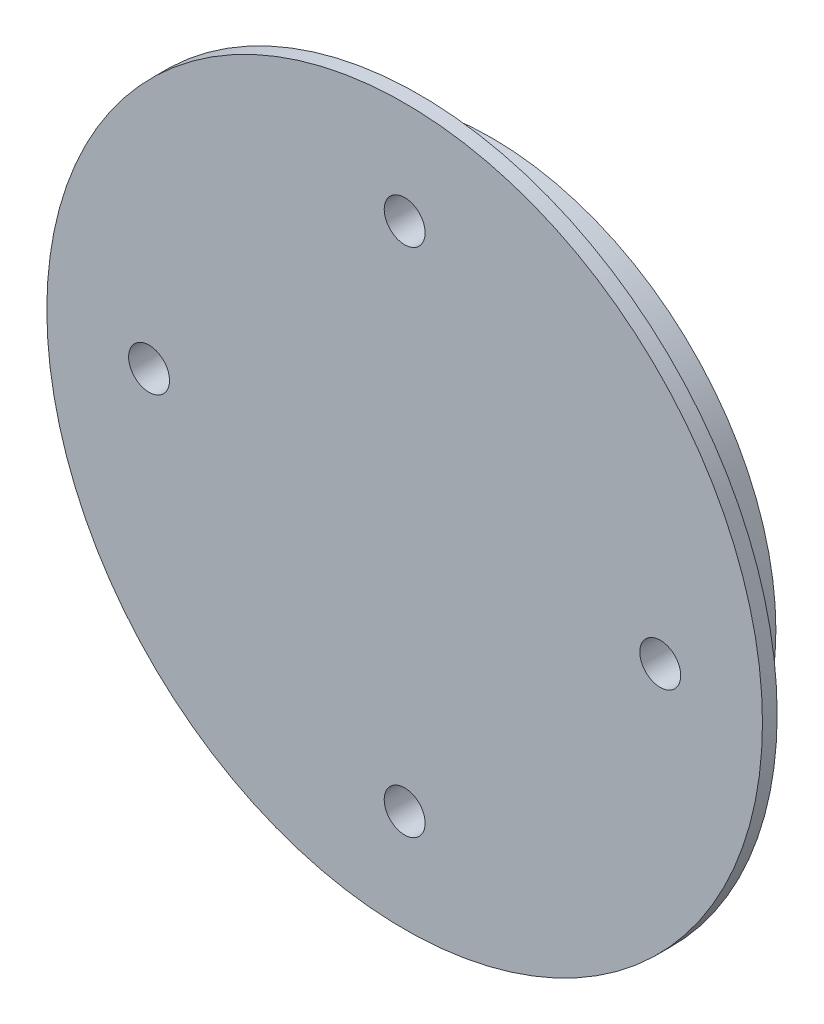
ISO-10303-21;
HEADER;
FILE_DESCRIPTION(('STEP AP214'),'2;1');
FILE_NAME('part.step','',(''),(''),'','','');
FILE_SCHEMA(('AUTOMOTIVE_DESIGN { 1 0 10303 214 1 1 1 1 }'));
ENDSEC;
DATA;
#1=APPLICATION_CONTEXT('core data for automotive mechanical design processes');
#2=APPLICATION_PROTOCOL_DEFINITION('international standard','automotive_design',2000,#1);
#3=PRODUCT_CONTEXT('',#1,'mechanical');
#4=PRODUCT('Part','Part','',(#3));
#5=PRODUCT_RELATED_PRODUCT_CATEGORY('part','',(#4));
#6=PRODUCT_DEFINITION_FORMATION('','',#4);
#7=PRODUCT_DEFINITION_CONTEXT('part definition',#1,'design');
#8=PRODUCT_DEFINITION('design','',#6,#7);
#9=PRODUCT_DEFINITION_SHAPE('','',#8);
#10=(LENGTH_UNIT() NAMED_UNIT(*) SI_UNIT(.MILLI.,.METRE.));
#11=(NAMED_UNIT(*) PLANE_ANGLE_UNIT() SI_UNIT($,.RADIAN.));
#12=(NAMED_UNIT(*) SI_UNIT($,.STERADIAN.) SOLID_ANGLE_UNIT());
#13=UNCERTAINTY_MEASURE_WITH_UNIT(LENGTH_MEASURE(1.E-05),#10,'distance_accuracy_value','');
#14=(GEOMETRIC_REPRESENTATION_CONTEXT(3) GLOBAL_UNCERTAINTY_ASSIGNED_CONTEXT((#13)) GLOBAL_UNIT_ASSIGNED_CONTEXT((#10,
#11,#12)) REPRESENTATION_CONTEXT('',''));
#15=CARTESIAN_POINT('',(0.,0.,0.));
#16=DIRECTION('',(0.,0.,1.));
#17=DIRECTION('',(1.,0.,0.));
#18=AXIS2_PLACEMENT_3D('',#15,#16,#17);
#19=CARTESIAN_POINT('',(0.,0.,2.5));
#20=DIRECTION('',(0.,0.,-1.));
#21=DIRECTION('',(-1.,0.,0.));
#22=AXIS2_PLACEMENT_3D('',#19,#20,#21);
#23=CYLINDRICAL_SURFACE('',#22,23.5);
#24=CARTESIAN_POINT('',(0.,0.,2.5));
#25=DIRECTION('',(0.,0.,1.));
#26=DIRECTION('',(1.,0.,0.));
#27=AXIS2_PLACEMENT_3D('',#24,#25,#26);
#28=CIRCLE('',#27,23.5);
#29=CARTESIAN_POINT('',(23.5,0.,2.5));
#30=VERTEX_POINT('',#29);
#31=EDGE_CURVE('E42',#30,#30,#28,.T.);
#32=ORIENTED_EDGE('',*,*,#31,.F.);
#33=EDGE_LOOP('',(#32));
#34=FACE_BOUND('',#33,.T.);
#35=CARTESIAN_POINT('',(0.,0.,0.));
#36=DIRECTION('',(0.,0.,1.));
#37=DIRECTION('',(1.,0.,0.));
#38=AXIS2_PLACEMENT_3D('',#35,#36,#37);
#39=CIRCLE('',#38,23.5);
#40=CARTESIAN_POINT('',(23.5,0.,0.));
#41=VERTEX_POINT('',#40);
#42=EDGE_CURVE('E38',#41,#41,#39,.T.);
#43=ORIENTED_EDGE('',*,*,#42,.T.);
#44=EDGE_LOOP('',(#43));
#45=FACE_BOUND('',#44,.T.);
#46=ADVANCED_FACE('F35',(#34,#45),#23,.T.);
#47=CARTESIAN_POINT('',(0.,0.,0.));
#48=DIRECTION('',(0.,0.,1.));
#49=DIRECTION('',(1.,0.,0.));
#50=AXIS2_PLACEMENT_3D('',#47,#48,#49);
#51=PLANE('',#50);
#52=CARTESIAN_POINT('',(0.,0.,0.));
#53=DIRECTION('',(0.,0.,-1.));
#54=DIRECTION('',(-1.,0.,0.));
#55=AXIS2_PLACEMENT_3D('',#52,#53,#54);
#56=CIRCLE('',#55,22.225);
#57=CARTESIAN_POINT('',(-22.225,0.,0.));
#58=VERTEX_POINT('',#57);
#59=EDGE_CURVE('E10',#58,#58,#56,.T.);
#60=ORIENTED_EDGE('',*,*,#59,.F.);
#61=EDGE_LOOP('',(#60));
#62=FACE_BOUND('',#61,.T.);
#63=ORIENTED_EDGE('',*,*,#42,.F.);
#64=EDGE_LOOP('',(#63));
#65=FACE_BOUND('',#64,.T.);
#66=ADVANCED_FACE('F103',(#62,#65),#51,.F.);
#67=CARTESIAN_POINT('',(0.,0.,-3.175));
#68=DIRECTION('',(0.,0.,1.));
#69=DIRECTION('',(1.,0.,0.));
#70=AXIS2_PLACEMENT_3D('',#67,#68,#69);
#71=CYLINDRICAL_SURFACE('',#70,22.225);
#72=CARTESIAN_POINT('',(0.,0.,-3.175));
#73=DIRECTION('',(0.,0.,-1.));
#74=DIRECTION('',(-1.,0.,0.));
#75=AXIS2_PLACEMENT_3D('',#72,#73,#74);
#76=CIRCLE('',#75,22.225);
#77=CARTESIAN_POINT('',(-22.225,0.,-3.175));
#78=VERTEX_POINT('',#77);
#79=EDGE_CURVE('E48',#78,#78,#76,.T.);
#80=ORIENTED_EDGE('',*,*,#79,.F.);
#81=EDGE_LOOP('',(#80));
#82=FACE_BOUND('',#81,.T.);
#83=ORIENTED_EDGE('',*,*,#59,.T.);
#84=EDGE_LOOP('',(#83));
#85=FACE_BOUND('',#84,.T.);
#86=ADVANCED_FACE('F108',(#82,#85),#71,.T.);
#87=CARTESIAN_POINT('',(0.,0.,-3.175));
#88=DIRECTION('',(0.,0.,-1.));
#89=DIRECTION('',(-1.,0.,0.));
#90=AXIS2_PLACEMENT_3D('',#87,#88,#89);
#91=PLANE('',#90);
#92=CARTESIAN_POINT('',(0.,20.,-3.175));
#93=DIRECTION('',(0.,0.,-1.));
#94=DIRECTION('',(-1.,0.,0.));
#95=AXIS2_PLACEMENT_3D('',#92,#93,#94);
#96=CIRCLE('',#95,1.6);
#97=CARTESIAN_POINT('',(-1.6,20.,-3.175));
#98=VERTEX_POINT('',#97);
#99=EDGE_CURVE('E51',#98,#98,#96,.T.);
#100=ORIENTED_EDGE('',*,*,#99,.F.);
#101=EDGE_LOOP('',(#100));
#102=FACE_BOUND('',#101,.T.);
#103=CARTESIAN_POINT('',(-20.,0.,-3.175));
#104=DIRECTION('',(0.,0.,-1.));
#105=DIRECTION('',(-1.,0.,0.));
#106=AXIS2_PLACEMENT_3D('',#103,#104,#105);
#107=CIRCLE('',#106,1.6);
#108=CARTESIAN_POINT('',(-21.6,0.,-3.175));
#109=VERTEX_POINT('',#108);
#110=EDGE_CURVE('E59',#109,#109,#107,.T.);
#111=ORIENTED_EDGE('',*,*,#110,.F.);
#112=EDGE_LOOP('',(#111));
#113=FACE_BOUND('',#112,.T.);
#114=CARTESIAN_POINT('',(0.,-20.,-3.175));
#115=DIRECTION('',(0.,0.,-1.));
#116=DIRECTION('',(-1.,0.,0.));
#117=AXIS2_PLACEMENT_3D('',#114,#115,#116);
#118=CIRCLE('',#117,1.6);
#119=CARTESIAN_POINT('',(-1.6,-20.,-3.175));
#120=VERTEX_POINT('',#119);
#121=EDGE_CURVE('E55',#120,#120,#118,.T.);
#122=ORIENTED_EDGE('',*,*,#121,.F.);
#123=EDGE_LOOP('',(#122));
#124=FACE_BOUND('',#123,.T.);
#125=CARTESIAN_POINT('',(20.,0.,-3.175));
#126=DIRECTION('',(0.,0.,-1.));
#127=DIRECTION('',(-1.,0.,0.));
#128=AXIS2_PLACEMENT_3D('',#125,#126,#127);
#129=CIRCLE('',#128,1.6);
#130=CARTESIAN_POINT('',(18.4,0.,-3.175));
#131=VERTEX_POINT('',#130);
#132=EDGE_CURVE('E52',#131,#131,#129,.T.);
#133=ORIENTED_EDGE('',*,*,#132,.F.);
#134=EDGE_LOOP('',(#133));
#135=FACE_BOUND('',#134,.T.);
#136=ORIENTED_EDGE('',*,*,#79,.T.);
#137=EDGE_LOOP('',(#136));
#138=FACE_BOUND('',#137,.T.);
#139=ADVANCED_FACE('F134',(#102,#113,#124,#135,#138),#91,.T.);
#140=CARTESIAN_POINT('',(20.,0.,2.5));
#141=DIRECTION('',(0.,0.,-1.));
#142=DIRECTION('',(-1.,0.,0.));
#143=AXIS2_PLACEMENT_3D('',#140,#141,#142);
#144=CYLINDRICAL_SURFACE('',#143,1.6);
#145=ORIENTED_EDGE('',*,*,#132,.T.);
#146=EDGE_LOOP('',(#145));
#147=FACE_BOUND('',#146,.T.);
#148=CARTESIAN_POINT('',(20.,0.,3.65));
#149=DIRECTION('',(0.,0.,1.));
#150=DIRECTION('',(1.,0.,0.));
#151=AXIS2_PLACEMENT_3D('',#148,#149,#150);
#152=CIRCLE('',#151,1.6);
#153=CARTESIAN_POINT('',(21.6,0.,3.65));
#154=VERTEX_POINT('',#153);
#155=EDGE_CURVE('E78',#154,#154,#152,.T.);
#156=ORIENTED_EDGE('',*,*,#155,.T.);
#157=EDGE_LOOP('',(#156));
#158=FACE_BOUND('',#157,.T.);
#159=ADVANCED_FACE('F82',(#147,#158),#144,.F.);
#160=CARTESIAN_POINT('',(0.,-20.,2.5));
#161=DIRECTION('',(0.,0.,-1.));
#162=DIRECTION('',(-1.,0.,0.));
#163=AXIS2_PLACEMENT_3D('',#160,#161,#162);
#164=CYLINDRICAL_SURFACE('',#163,1.6);
#165=ORIENTED_EDGE('',*,*,#121,.T.);
#166=EDGE_LOOP('',(#165));
#167=FACE_BOUND('',#166,.T.);
#168=CARTESIAN_POINT('',(0.,-20.,3.65));
#169=DIRECTION('',(0.,0.,1.));
#170=DIRECTION('',(1.,0.,0.));
#171=AXIS2_PLACEMENT_3D('',#168,#169,#170);
#172=CIRCLE('',#171,1.6);
#173=CARTESIAN_POINT('',(1.6,-20.,3.65));
#174=VERTEX_POINT('',#173);
#175=EDGE_CURVE('E75',#174,#174,#172,.T.);
#176=ORIENTED_EDGE('',*,*,#175,.T.);
#177=EDGE_LOOP('',(#176));
#178=FACE_BOUND('',#177,.T.);
#179=ADVANCED_FACE('F127',(#167,#178),#164,.F.);
#180=CARTESIAN_POINT('',(-20.,0.,2.5));
#181=DIRECTION('',(0.,0.,-1.));
#182=DIRECTION('',(-1.,0.,0.));
#183=AXIS2_PLACEMENT_3D('',#180,#181,#182);
#184=CYLINDRICAL_SURFACE('',#183,1.6);
#185=ORIENTED_EDGE('',*,*,#110,.T.);
#186=EDGE_LOOP('',(#185));
#187=FACE_BOUND('',#186,.T.);
#188=CARTESIAN_POINT('',(-20.,0.,3.65));
#189=DIRECTION('',(0.,0.,1.));
#190=DIRECTION('',(1.,0.,0.));
#191=AXIS2_PLACEMENT_3D('',#188,#189,#190);
#192=CIRCLE('',#191,1.6);
#193=CARTESIAN_POINT('',(-18.4,0.,3.65));
#194=VERTEX_POINT('',#193);
#195=EDGE_CURVE('E72',#194,#194,#192,.T.);
#196=ORIENTED_EDGE('',*,*,#195,.T.);
#197=EDGE_LOOP('',(#196));
#198=FACE_BOUND('',#197,.T.);
#199=ADVANCED_FACE('F97',(#187,#198),#184,.F.);
#200=CARTESIAN_POINT('',(0.,20.,2.5));
#201=DIRECTION('',(0.,0.,-1.));
#202=DIRECTION('',(-1.,0.,0.));
#203=AXIS2_PLACEMENT_3D('',#200,#201,#202);
#204=CYLINDRICAL_SURFACE('',#203,1.6);
#205=ORIENTED_EDGE('',*,*,#99,.T.);
#206=EDGE_LOOP('',(#205));
#207=FACE_BOUND('',#206,.T.);
#208=CARTESIAN_POINT('',(0.,20.,3.65));
#209=DIRECTION('',(0.,0.,1.));
#210=DIRECTION('',(1.,0.,0.));
#211=AXIS2_PLACEMENT_3D('',#208,#209,#210);
#212=CIRCLE('',#211,1.6);
#213=CARTESIAN_POINT('',(1.6,20.,3.65));
#214=VERTEX_POINT('',#213);
#215=EDGE_CURVE('E67',#214,#214,#212,.T.);
#216=ORIENTED_EDGE('',*,*,#215,.T.);
#217=EDGE_LOOP('',(#216));
#218=FACE_BOUND('',#217,.T.);
#219=ADVANCED_FACE('F87',(#207,#218),#204,.F.);
#220=CARTESIAN_POINT('',(0.,0.,3.65));
#221=DIRECTION('',(0.,0.,1.));
#222=DIRECTION('',(1.,0.,0.));
#223=AXIS2_PLACEMENT_3D('',#220,#221,#222);
#224=PLANE('',#223);
#225=ORIENTED_EDGE('',*,*,#175,.F.);
#226=EDGE_LOOP('',(#225));
#227=FACE_BOUND('',#226,.T.);
#228=ORIENTED_EDGE('',*,*,#215,.F.);
#229=EDGE_LOOP('',(#228));
#230=FACE_BOUND('',#229,.T.);
#231=CARTESIAN_POINT('',(0.,0.,3.65));
#232=DIRECTION('',(0.,0.,1.));
#233=DIRECTION('',(1.,0.,0.));
#234=AXIS2_PLACEMENT_3D('',#231,#232,#233);
#235=CIRCLE('',#234,28.);
#236=CARTESIAN_POINT('',(28.,0.,3.65));
#237=VERTEX_POINT('',#236);
#238=EDGE_CURVE('E56',#237,#237,#235,.T.);
#239=ORIENTED_EDGE('',*,*,#238,.T.);
#240=EDGE_LOOP('',(#239));
#241=FACE_BOUND('',#240,.T.);
#242=ORIENTED_EDGE('',*,*,#195,.F.);
#243=EDGE_LOOP('',(#242));
#244=FACE_BOUND('',#243,.T.);
#245=ORIENTED_EDGE('',*,*,#155,.F.);
#246=EDGE_LOOP('',(#245));
#247=FACE_BOUND('',#246,.T.);
#248=ADVANCED_FACE('F84',(#227,#230,#241,#244,#247),#224,.T.);
#249=CARTESIAN_POINT('',(0.,0.,2.5));
#250=DIRECTION('',(0.,0.,1.));
#251=DIRECTION('',(1.,0.,0.));
#252=AXIS2_PLACEMENT_3D('',#249,#250,#251);
#253=PLANE('',#252);
#254=ORIENTED_EDGE('',*,*,#31,.T.);
#255=EDGE_LOOP('',(#254));
#256=FACE_BOUND('',#255,.T.);
#257=CARTESIAN_POINT('',(0.,0.,2.5));
#258=DIRECTION('',(0.,0.,1.));
#259=DIRECTION('',(1.,0.,0.));
#260=AXIS2_PLACEMENT_3D('',#257,#258,#259);
#261=CIRCLE('',#260,28.);
#262=CARTESIAN_POINT('',(28.,0.,2.5));
#263=VERTEX_POINT('',#262);
#264=EDGE_CURVE('E64',#263,#263,#261,.T.);
#265=ORIENTED_EDGE('',*,*,#264,.F.);
#266=EDGE_LOOP('',(#265));
#267=FACE_BOUND('',#266,.T.);
#268=ADVANCED_FACE('F86',(#256,#267),#253,.F.);
#269=CARTESIAN_POINT('',(0.,0.,3.65));
#270=DIRECTION('',(0.,0.,-1.));
#271=DIRECTION('',(-1.,0.,0.));
#272=AXIS2_PLACEMENT_3D('',#269,#270,#271);
#273=CYLINDRICAL_SURFACE('',#272,28.);
#274=ORIENTED_EDGE('',*,*,#238,.F.);
#275=EDGE_LOOP('',(#274));
#276=FACE_BOUND('',#275,.T.);
#277=ORIENTED_EDGE('',*,*,#264,.T.);
#278=EDGE_LOOP('',(#277));
#279=FACE_BOUND('',#278,.T.);
#280=ADVANCED_FACE('F94',(#276,#279),#273,.T.);
#281=CLOSED_SHELL('',(#46,#66,#86,#139,#159,#179,#199,#219,#248,#268,#280));
#282=MANIFOLD_SOLID_BREP('B2',#281);
#283=ADVANCED_BREP_SHAPE_REPRESENTATION('',(#18,#282),#14);
#284=SHAPE_DEFINITION_REPRESENTATION(#9,#283);
ENDSEC;
END-ISO-10303-21;
